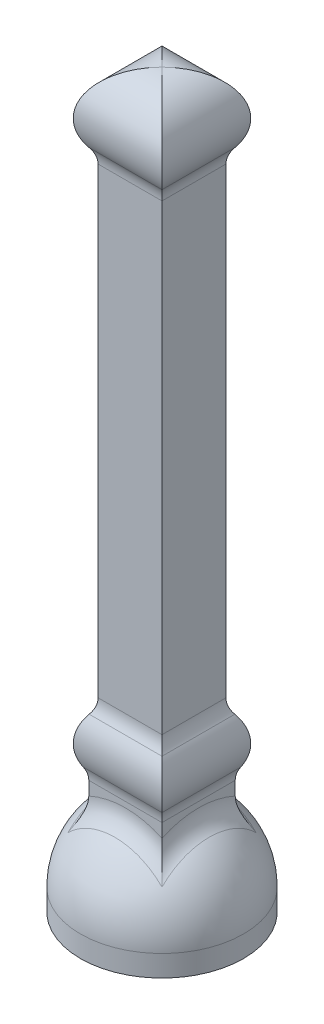
ISO-10303-21;
HEADER;
FILE_DESCRIPTION(('STEP AP214'),'2;1');
FILE_NAME('part.step','',(''),(''),'','','');
FILE_SCHEMA(('AUTOMOTIVE_DESIGN { 1 0 10303 214 1 1 1 1 }'));
ENDSEC;
DATA;
#1=APPLICATION_CONTEXT('core data for automotive mechanical design processes');
#2=APPLICATION_PROTOCOL_DEFINITION('international standard','automotive_design',2000,#1);
#3=PRODUCT_CONTEXT('',#1,'mechanical');
#4=PRODUCT('Part','Part','',(#3));
#5=PRODUCT_RELATED_PRODUCT_CATEGORY('part','',(#4));
#6=PRODUCT_DEFINITION_FORMATION('','',#4);
#7=PRODUCT_DEFINITION_CONTEXT('part definition',#1,'design');
#8=PRODUCT_DEFINITION('design','',#6,#7);
#9=PRODUCT_DEFINITION_SHAPE('','',#8);
#10=(LENGTH_UNIT() NAMED_UNIT(*) SI_UNIT(.MILLI.,.METRE.));
#11=(NAMED_UNIT(*) PLANE_ANGLE_UNIT() SI_UNIT($,.RADIAN.));
#12=(NAMED_UNIT(*) SI_UNIT($,.STERADIAN.) SOLID_ANGLE_UNIT());
#13=UNCERTAINTY_MEASURE_WITH_UNIT(LENGTH_MEASURE(1.E-05),#10,'distance_accuracy_value','');
#14=(GEOMETRIC_REPRESENTATION_CONTEXT(3) GLOBAL_UNCERTAINTY_ASSIGNED_CONTEXT((#13)) GLOBAL_UNIT_ASSIGNED_CONTEXT((#10,
#11,#12)) REPRESENTATION_CONTEXT('',''));
#15=CARTESIAN_POINT('',(0.,0.,0.));
#16=DIRECTION('',(0.,0.,1.));
#17=DIRECTION('',(1.,0.,0.));
#18=AXIS2_PLACEMENT_3D('',#15,#16,#17);
#19=CARTESIAN_POINT('',(-1.25,17.8825324213551,0.9));
#20=DIRECTION('',(0.,0.,-1.));
#21=DIRECTION('',(0.,1.,0.));
#22=AXIS2_PLACEMENT_3D('',#19,#20,#21);
#23=PLANE('',#22);
#24=DIRECTION('',(0.,-1.,0.));
#25=VECTOR('',#24,1.);
#26=CARTESIAN_POINT('',(-0.900000000000003,17.8825324213551,0.9));
#27=LINE('',#26,#25);
#28=CARTESIAN_POINT('',(-0.900000000000003,17.6353251595196,0.9));
#29=VERTEX_POINT('',#28);
#30=CARTESIAN_POINT('',(-0.900000000000002,4.6146748404804,0.899999999999998));
#31=VERTEX_POINT('',#30);
#32=EDGE_CURVE('E192',#29,#31,#27,.T.);
#33=ORIENTED_EDGE('',*,*,#32,.T.);
#34=DIRECTION('',(-1.,0.,0.));
#35=VECTOR('',#34,1.);
#36=CARTESIAN_POINT('',(0.899999999999988,4.6146748404804,0.899999999999999));
#37=LINE('',#36,#35);
#38=CARTESIAN_POINT('',(0.899999999999989,4.6146748404804,0.899999999999998));
#39=VERTEX_POINT('',#38);
#40=EDGE_CURVE('E292',#31,#39,#37,.F.);
#41=ORIENTED_EDGE('',*,*,#40,.T.);
#42=DIRECTION('',(0.,1.,0.));
#43=VECTOR('',#42,1.);
#44=CARTESIAN_POINT('',(0.899999999999991,17.8825324213551,0.9));
#45=LINE('',#44,#43);
#46=CARTESIAN_POINT('',(0.899999999999991,17.6353251595196,0.9));
#47=VERTEX_POINT('',#46);
#48=EDGE_CURVE('E162',#39,#47,#45,.T.);
#49=ORIENTED_EDGE('',*,*,#48,.T.);
#50=DIRECTION('',(-1.,0.,0.));
#51=VECTOR('',#50,1.);
#52=CARTESIAN_POINT('',(-0.900000000000004,17.6353251595196,0.9));
#53=LINE('',#52,#51);
#54=EDGE_CURVE('E289',#47,#29,#53,.T.);
#55=ORIENTED_EDGE('',*,*,#54,.T.);
#56=EDGE_LOOP('',(#33,#41,#49,#55));
#57=FACE_BOUND('',#56,.T.);
#58=ADVANCED_FACE('F39',(#57),#23,.F.);
#59=CARTESIAN_POINT('',(-1.25,18.75,0.));
#60=DIRECTION('',(1.,0.,0.));
#61=DIRECTION('',(0.,0.,-1.));
#62=AXIS2_PLACEMENT_3D('',#59,#60,#61);
#63=CYLINDRICAL_SURFACE('',#62,1.25);
#64=CARTESIAN_POINT('',(0.,18.75,0.));
#65=DIRECTION('',(0.707106781186546,0.,0.707106781186549));
#66=DIRECTION('',(0.707106781186549,0.,-0.707106781186546));
#67=AXIS2_PLACEMENT_3D('',#64,#65,#66);
#68=ELLIPSE('',#67,1.76776695296637,1.25);
#69=CARTESIAN_POINT('',(0.,20.,0.));
#70=VERTEX_POINT('',#69);
#71=CARTESIAN_POINT('',(-1.02564102564103,18.0354648458459,1.02564102564103));
#72=VERTEX_POINT('',#71);
#73=EDGE_CURVE('E158',#70,#72,#68,.T.);
#74=ORIENTED_EDGE('',*,*,#73,.T.);
#75=DIRECTION('',(1.,0.,0.));
#76=VECTOR('',#75,1.);
#77=CARTESIAN_POINT('',(-1.25,18.0354648458459,1.02564102564103));
#78=LINE('',#77,#76);
#79=CARTESIAN_POINT('',(1.02564102564102,18.0354648458459,1.02564102564103));
#80=VERTEX_POINT('',#79);
#81=EDGE_CURVE('E49',#72,#80,#78,.T.);
#82=ORIENTED_EDGE('',*,*,#81,.T.);
#83=CARTESIAN_POINT('',(0.,18.75,0.));
#84=DIRECTION('',(0.707106781186551,0.,-0.707106781186544));
#85=DIRECTION('',(0.707106781186544,0.,0.707106781186551));
#86=AXIS2_PLACEMENT_3D('',#83,#84,#85);
#87=ELLIPSE('',#86,1.76776695296636,1.25);
#88=EDGE_CURVE('E155',#80,#70,#87,.F.);
#89=ORIENTED_EDGE('',*,*,#88,.T.);
#90=EDGE_LOOP('',(#74,#82,#89));
#91=FACE_BOUND('',#90,.T.);
#92=ADVANCED_FACE('F157',(#91),#63,.T.);
#93=CARTESIAN_POINT('',(-0.899999999999996,17.8825324213551,-1.25000000000001));
#94=DIRECTION('',(1.,0.,0.));
#95=DIRECTION('',(0.,0.,-1.));
#96=AXIS2_PLACEMENT_3D('',#93,#94,#95);
#97=PLANE('',#96);
#98=DIRECTION('',(0.,-1.,0.));
#99=VECTOR('',#98,1.);
#100=CARTESIAN_POINT('',(-0.899999999999997,17.8825324213551,-0.9));
#101=LINE('',#100,#99);
#102=CARTESIAN_POINT('',(-0.899999999999997,17.6353251595196,-0.9));
#103=VERTEX_POINT('',#102);
#104=CARTESIAN_POINT('',(-0.899999999999995,4.6146748404804,-0.899999999999998));
#105=VERTEX_POINT('',#104);
#106=EDGE_CURVE('E183',#103,#105,#101,.T.);
#107=ORIENTED_EDGE('',*,*,#106,.T.);
#108=DIRECTION('',(0.,0.,-1.));
#109=VECTOR('',#108,1.);
#110=CARTESIAN_POINT('',(-0.900000000000002,4.6146748404804,0.899999999999998));
#111=LINE('',#110,#109);
#112=EDGE_CURVE('E286',#105,#31,#111,.F.);
#113=ORIENTED_EDGE('',*,*,#112,.T.);
#114=ORIENTED_EDGE('',*,*,#32,.F.);
#115=DIRECTION('',(0.,0.,-1.));
#116=VECTOR('',#115,1.);
#117=CARTESIAN_POINT('',(-0.899999999999997,17.6353251595196,-0.9));
#118=LINE('',#117,#116);
#119=EDGE_CURVE('E283',#29,#103,#118,.T.);
#120=ORIENTED_EDGE('',*,*,#119,.T.);
#121=EDGE_LOOP('',(#107,#113,#114,#120));
#122=FACE_BOUND('',#121,.T.);
#123=ADVANCED_FACE('F404',(#122),#97,.F.);
#124=CARTESIAN_POINT('',(-1.25,3.5,0.));
#125=DIRECTION('',(1.,0.,0.));
#126=DIRECTION('',(0.,0.,-1.));
#127=AXIS2_PLACEMENT_3D('',#124,#125,#126);
#128=CYLINDRICAL_SURFACE('',#127,1.25);
#129=CARTESIAN_POINT('',(0.,3.5,0.));
#130=DIRECTION('',(0.707106781186546,0.,0.707106781186549));
#131=DIRECTION('',(0.707106781186549,0.,-0.707106781186546));
#132=AXIS2_PLACEMENT_3D('',#129,#130,#131);
#133=ELLIPSE('',#132,1.76776695296637,1.25);
#134=CARTESIAN_POINT('',(-1.02564102564103,4.2145351541541,1.02564102564102));
#135=VERTEX_POINT('',#134);
#136=CARTESIAN_POINT('',(-1.10965786412102,2.92453547060277,1.10965786412102));
#137=VERTEX_POINT('',#136);
#138=EDGE_CURVE('E182',#135,#137,#133,.T.);
#139=ORIENTED_EDGE('',*,*,#138,.T.);
#140=DIRECTION('',(1.,0.,0.));
#141=VECTOR('',#140,1.);
#142=CARTESIAN_POINT('',(-1.25,2.92453547060277,1.10965786412102));
#143=LINE('',#142,#141);
#144=CARTESIAN_POINT('',(1.10965786412101,2.92453547060277,1.10965786412102));
#145=VERTEX_POINT('',#144);
#146=EDGE_CURVE('E221',#137,#145,#143,.T.);
#147=ORIENTED_EDGE('',*,*,#146,.T.);
#148=CARTESIAN_POINT('',(0.,3.5,0.));
#149=DIRECTION('',(0.707106781186551,0.,-0.707106781186544));
#150=DIRECTION('',(0.707106781186544,0.,0.707106781186551));
#151=AXIS2_PLACEMENT_3D('',#148,#149,#150);
#152=ELLIPSE('',#151,1.76776695296636,1.25);
#153=CARTESIAN_POINT('',(1.02564102564101,4.2145351541541,1.02564102564102));
#154=VERTEX_POINT('',#153);
#155=EDGE_CURVE('E163',#145,#154,#152,.F.);
#156=ORIENTED_EDGE('',*,*,#155,.T.);
#157=DIRECTION('',(1.,0.,0.));
#158=VECTOR('',#157,1.);
#159=CARTESIAN_POINT('',(-1.25,4.2145351541541,1.02564102564102));
#160=LINE('',#159,#158);
#161=EDGE_CURVE('E218',#154,#135,#160,.F.);
#162=ORIENTED_EDGE('',*,*,#161,.T.);
#163=EDGE_LOOP('',(#139,#147,#156,#162));
#164=FACE_BOUND('',#163,.T.);
#165=ADVANCED_FACE('F441',(#164),#128,.T.);
#166=CARTESIAN_POINT('',(-1.25,2.79331594688065,1.03106626802879));
#167=DIRECTION('',(0.,0.,-1.));
#168=DIRECTION('',(-1.,0.,0.));
#169=AXIS2_PLACEMENT_3D('',#166,#167,#168);
#170=PLANE('',#169);
#171=DIRECTION('',(0.,1.,0.));
#172=VECTOR('',#171,1.);
#173=CARTESIAN_POINT('',(1.03106626802878,2.79331594688065,1.03106626802879));
#174=LINE('',#173,#172);
#175=CARTESIAN_POINT('',(1.03106626802878,2.2176981728417,1.03106626802879));
#176=VERTEX_POINT('',#175);
#177=CARTESIAN_POINT('',(1.03106626802878,2.60227533414031,1.03106626802879));
#178=VERTEX_POINT('',#177);
#179=EDGE_CURVE('E494',#176,#178,#174,.T.);
#180=ORIENTED_EDGE('',*,*,#179,.T.);
#181=DIRECTION('',(-1.,0.,0.));
#182=VECTOR('',#181,1.);
#183=CARTESIAN_POINT('',(-1.03106626802879,2.60227533414031,1.03106626802879));
#184=LINE('',#183,#182);
#185=CARTESIAN_POINT('',(-1.03106626802879,2.60227533414031,1.03106626802879));
#186=VERTEX_POINT('',#185);
#187=EDGE_CURVE('E227',#178,#186,#184,.T.);
#188=ORIENTED_EDGE('',*,*,#187,.T.);
#189=DIRECTION('',(0.,-1.,0.));
#190=VECTOR('',#189,1.);
#191=CARTESIAN_POINT('',(-1.03106626802879,2.79331594688065,1.03106626802879));
#192=LINE('',#191,#190);
#193=CARTESIAN_POINT('',(-1.03106626802879,2.21769817284169,1.03106626802879));
#194=VERTEX_POINT('',#193);
#195=EDGE_CURVE('E187',#186,#194,#192,.T.);
#196=ORIENTED_EDGE('',*,*,#195,.T.);
#197=CARTESIAN_POINT('',(0.,0.,1.03106626802879));
#198=DIRECTION('',(0.,0.,-1.));
#199=DIRECTION('',(-1.,0.,0.));
#200=AXIS2_PLACEMENT_3D('',#197,#198,#199);
#201=CIRCLE('',#200,2.44566613316131);
#202=EDGE_CURVE('E224',#194,#176,#201,.T.);
#203=ORIENTED_EDGE('',*,*,#202,.T.);
#204=EDGE_LOOP('',(#180,#188,#196,#203));
#205=FACE_BOUND('',#204,.T.);
#206=ADVANCED_FACE('F486',(#205),#170,.F.);
#207=CARTESIAN_POINT('',(0.,18.75,-1.25));
#208=DIRECTION('',(0.,0.,1.));
#209=DIRECTION('',(1.,0.,0.));
#210=AXIS2_PLACEMENT_3D('',#207,#208,#209);
#211=CYLINDRICAL_SURFACE('',#210,1.25);
#212=CARTESIAN_POINT('',(0.,18.75,0.));
#213=DIRECTION('',(-0.707106781186549,0.,0.707106781186546));
#214=DIRECTION('',(0.707106781186546,0.,0.707106781186549));
#215=AXIS2_PLACEMENT_3D('',#212,#213,#214);
#216=ELLIPSE('',#215,1.76776695296637,1.25);
#217=CARTESIAN_POINT('',(-1.02564102564102,18.0354648458459,-1.02564102564103));
#218=VERTEX_POINT('',#217);
#219=EDGE_CURVE('E177',#70,#218,#216,.T.);
#220=ORIENTED_EDGE('',*,*,#219,.T.);
#221=DIRECTION('',(0.,0.,1.));
#222=VECTOR('',#221,1.);
#223=CARTESIAN_POINT('',(-1.02564102564102,18.0354648458459,-1.25000000000001));
#224=LINE('',#223,#222);
#225=EDGE_CURVE('E64',#218,#72,#224,.T.);
#226=ORIENTED_EDGE('',*,*,#225,.T.);
#227=ORIENTED_EDGE('',*,*,#73,.F.);
#228=EDGE_LOOP('',(#220,#226,#227));
#229=FACE_BOUND('',#228,.T.);
#230=ADVANCED_FACE('F185',(#229),#211,.T.);
#231=CARTESIAN_POINT('',(0.,3.5,-1.25));
#232=DIRECTION('',(0.,0.,1.));
#233=DIRECTION('',(1.,0.,0.));
#234=AXIS2_PLACEMENT_3D('',#231,#232,#233);
#235=CYLINDRICAL_SURFACE('',#234,1.25);
#236=CARTESIAN_POINT('',(0.,3.5,0.));
#237=DIRECTION('',(-0.707106781186549,0.,0.707106781186546));
#238=DIRECTION('',(0.707106781186546,0.,0.707106781186549));
#239=AXIS2_PLACEMENT_3D('',#236,#237,#238);
#240=ELLIPSE('',#239,1.76776695296637,1.25);
#241=CARTESIAN_POINT('',(-1.02564102564102,4.2145351541541,-1.02564102564102));
#242=VERTEX_POINT('',#241);
#243=CARTESIAN_POINT('',(-1.10965786412101,2.92453547060277,-1.10965786412102));
#244=VERTEX_POINT('',#243);
#245=EDGE_CURVE('E423',#242,#244,#240,.T.);
#246=ORIENTED_EDGE('',*,*,#245,.T.);
#247=DIRECTION('',(0.,0.,1.));
#248=VECTOR('',#247,1.);
#249=CARTESIAN_POINT('',(-1.10965786412101,2.92453547060277,-1.25000000000001));
#250=LINE('',#249,#248);
#251=EDGE_CURVE('E207',#244,#137,#250,.T.);
#252=ORIENTED_EDGE('',*,*,#251,.T.);
#253=ORIENTED_EDGE('',*,*,#138,.F.);
#254=DIRECTION('',(0.,0.,1.));
#255=VECTOR('',#254,1.);
#256=CARTESIAN_POINT('',(-1.02564102564102,4.2145351541541,-1.25000000000001));
#257=LINE('',#256,#255);
#258=EDGE_CURVE('E204',#135,#242,#257,.F.);
#259=ORIENTED_EDGE('',*,*,#258,.T.);
#260=EDGE_LOOP('',(#246,#252,#253,#259));
#261=FACE_BOUND('',#260,.T.);
#262=ADVANCED_FACE('F443',(#261),#235,.T.);
#263=CARTESIAN_POINT('',(-1.03106626802878,2.79331594688065,-1.25000000000001));
#264=DIRECTION('',(1.,0.,0.));
#265=DIRECTION('',(0.,0.,-1.));
#266=AXIS2_PLACEMENT_3D('',#263,#264,#265);
#267=PLANE('',#266);
#268=ORIENTED_EDGE('',*,*,#195,.F.);
#269=DIRECTION('',(0.,0.,-1.));
#270=VECTOR('',#269,1.);
#271=CARTESIAN_POINT('',(-1.03106626802878,2.60227533414031,-1.03106626802879));
#272=LINE('',#271,#270);
#273=CARTESIAN_POINT('',(-1.03106626802878,2.60227533414031,-1.03106626802879));
#274=VERTEX_POINT('',#273);
#275=EDGE_CURVE('E214',#186,#274,#272,.T.);
#276=ORIENTED_EDGE('',*,*,#275,.T.);
#277=DIRECTION('',(0.,-1.,0.));
#278=VECTOR('',#277,1.);
#279=CARTESIAN_POINT('',(-1.03106626802878,2.79331594688065,-1.03106626802879));
#280=LINE('',#279,#278);
#281=CARTESIAN_POINT('',(-1.03106626802878,2.21769817284169,-1.03106626802879));
#282=VERTEX_POINT('',#281);
#283=EDGE_CURVE('E200',#274,#282,#280,.T.);
#284=ORIENTED_EDGE('',*,*,#283,.T.);
#285=CARTESIAN_POINT('',(-1.03106626802879,0.,0.));
#286=DIRECTION('',(1.,0.,0.));
#287=DIRECTION('',(0.,0.,-1.));
#288=AXIS2_PLACEMENT_3D('',#285,#286,#287);
#289=CIRCLE('',#288,2.44566613316131);
#290=EDGE_CURVE('E211',#282,#194,#289,.T.);
#291=ORIENTED_EDGE('',*,*,#290,.T.);
#292=EDGE_LOOP('',(#268,#276,#284,#291));
#293=FACE_BOUND('',#292,.T.);
#294=ADVANCED_FACE('F471',(#293),#267,.F.);
#295=CARTESIAN_POINT('',(1.25,18.75,0.));
#296=DIRECTION('',(-1.,0.,0.));
#297=DIRECTION('',(0.,0.,1.));
#298=AXIS2_PLACEMENT_3D('',#295,#296,#297);
#299=CYLINDRICAL_SURFACE('',#298,1.25);
#300=CARTESIAN_POINT('',(0.,18.75,0.));
#301=DIRECTION('',(-0.707106781186544,0.,-0.707106781186551));
#302=DIRECTION('',(-0.707106781186551,0.,0.707106781186544));
#303=AXIS2_PLACEMENT_3D('',#300,#301,#302);
#304=ELLIPSE('',#303,1.76776695296638,1.25);
#305=CARTESIAN_POINT('',(1.02564102564104,18.0354648458459,-1.02564102564103));
#306=VERTEX_POINT('',#305);
#307=EDGE_CURVE('E166',#70,#306,#304,.T.);
#308=ORIENTED_EDGE('',*,*,#307,.T.);
#309=DIRECTION('',(-1.,0.,0.));
#310=VECTOR('',#309,1.);
#311=CARTESIAN_POINT('',(1.25,18.0354648458459,-1.02564102564103));
#312=LINE('',#311,#310);
#313=EDGE_CURVE('E180',#306,#218,#312,.T.);
#314=ORIENTED_EDGE('',*,*,#313,.T.);
#315=ORIENTED_EDGE('',*,*,#219,.F.);
#316=EDGE_LOOP('',(#308,#314,#315));
#317=FACE_BOUND('',#316,.T.);
#318=ADVANCED_FACE('F178',(#317),#299,.T.);
#319=CARTESIAN_POINT('',(1.25,17.8825324213551,-0.9));
#320=DIRECTION('',(0.,0.,1.));
#321=DIRECTION('',(0.,-1.,0.));
#322=AXIS2_PLACEMENT_3D('',#319,#320,#321);
#323=PLANE('',#322);
#324=DIRECTION('',(0.,-1.,0.));
#325=VECTOR('',#324,1.);
#326=CARTESIAN_POINT('',(0.90000000000001,17.8825324213551,-0.9));
#327=LINE('',#326,#325);
#328=CARTESIAN_POINT('',(0.90000000000001,17.6353251595196,-0.9));
#329=VERTEX_POINT('',#328);
#330=CARTESIAN_POINT('',(0.900000000000008,4.6146748404804,-0.899999999999998));
#331=VERTEX_POINT('',#330);
#332=EDGE_CURVE('E457',#329,#331,#327,.T.);
#333=ORIENTED_EDGE('',*,*,#332,.T.);
#334=DIRECTION('',(1.,0.,0.));
#335=VECTOR('',#334,1.);
#336=CARTESIAN_POINT('',(-0.899999999999995,4.6146748404804,-0.899999999999998));
#337=LINE('',#336,#335);
#338=EDGE_CURVE('E280',#331,#105,#337,.F.);
#339=ORIENTED_EDGE('',*,*,#338,.T.);
#340=ORIENTED_EDGE('',*,*,#106,.F.);
#341=DIRECTION('',(1.,0.,0.));
#342=VECTOR('',#341,1.);
#343=CARTESIAN_POINT('',(0.90000000000001,17.6353251595196,-0.9));
#344=LINE('',#343,#342);
#345=EDGE_CURVE('E276',#103,#329,#344,.T.);
#346=ORIENTED_EDGE('',*,*,#345,.T.);
#347=EDGE_LOOP('',(#333,#339,#340,#346));
#348=FACE_BOUND('',#347,.T.);
#349=ADVANCED_FACE('F724',(#348),#323,.F.);
#350=CARTESIAN_POINT('',(1.25,3.5,0.));
#351=DIRECTION('',(-1.,0.,0.));
#352=DIRECTION('',(0.,0.,1.));
#353=AXIS2_PLACEMENT_3D('',#350,#351,#352);
#354=CYLINDRICAL_SURFACE('',#353,1.25);
#355=CARTESIAN_POINT('',(0.,3.5,0.));
#356=DIRECTION('',(-0.707106781186544,0.,-0.707106781186551));
#357=DIRECTION('',(-0.707106781186551,0.,0.707106781186544));
#358=AXIS2_PLACEMENT_3D('',#355,#356,#357);
#359=ELLIPSE('',#358,1.76776695296638,1.25);
#360=CARTESIAN_POINT('',(1.02564102564104,4.2145351541541,-1.02564102564102));
#361=VERTEX_POINT('',#360);
#362=CARTESIAN_POINT('',(1.10965786412103,2.92453547060277,-1.10965786412102));
#363=VERTEX_POINT('',#362);
#364=EDGE_CURVE('E175',#361,#363,#359,.T.);
#365=ORIENTED_EDGE('',*,*,#364,.T.);
#366=DIRECTION('',(-1.,0.,0.));
#367=VECTOR('',#366,1.);
#368=CARTESIAN_POINT('',(1.25,2.92453547060277,-1.10965786412102));
#369=LINE('',#368,#367);
#370=EDGE_CURVE('E246',#363,#244,#369,.T.);
#371=ORIENTED_EDGE('',*,*,#370,.T.);
#372=ORIENTED_EDGE('',*,*,#245,.F.);
#373=DIRECTION('',(-1.,0.,0.));
#374=VECTOR('',#373,1.);
#375=CARTESIAN_POINT('',(1.25,4.2145351541541,-1.02564102564102));
#376=LINE('',#375,#374);
#377=EDGE_CURVE('E243',#242,#361,#376,.F.);
#378=ORIENTED_EDGE('',*,*,#377,.T.);
#379=EDGE_LOOP('',(#365,#371,#372,#378));
#380=FACE_BOUND('',#379,.T.);
#381=ADVANCED_FACE('F420',(#380),#354,.T.);
#382=CARTESIAN_POINT('',(1.25,2.79331594688065,-1.03106626802879));
#383=DIRECTION('',(0.,0.,1.));
#384=DIRECTION('',(1.,0.,0.));
#385=AXIS2_PLACEMENT_3D('',#382,#383,#384);
#386=PLANE('',#385);
#387=ORIENTED_EDGE('',*,*,#283,.F.);
#388=DIRECTION('',(1.,0.,0.));
#389=VECTOR('',#388,1.);
#390=CARTESIAN_POINT('',(1.0310662680288,2.60227533414031,-1.03106626802879));
#391=LINE('',#390,#389);
#392=CARTESIAN_POINT('',(1.0310662680288,2.60227533414031,-1.03106626802879));
#393=VERTEX_POINT('',#392);
#394=EDGE_CURVE('E253',#274,#393,#391,.T.);
#395=ORIENTED_EDGE('',*,*,#394,.T.);
#396=DIRECTION('',(0.,-1.,0.));
#397=VECTOR('',#396,1.);
#398=CARTESIAN_POINT('',(1.0310662680288,2.79331594688065,-1.03106626802879));
#399=LINE('',#398,#397);
#400=CARTESIAN_POINT('',(1.0310662680288,2.21769817284169,-1.03106626802879));
#401=VERTEX_POINT('',#400);
#402=EDGE_CURVE('E174',#393,#401,#399,.T.);
#403=ORIENTED_EDGE('',*,*,#402,.T.);
#404=CARTESIAN_POINT('',(0.,0.,-1.03106626802879));
#405=DIRECTION('',(0.,0.,1.));
#406=DIRECTION('',(1.,0.,0.));
#407=AXIS2_PLACEMENT_3D('',#404,#405,#406);
#408=CIRCLE('',#407,2.44566613316131);
#409=EDGE_CURVE('E249',#401,#282,#408,.T.);
#410=ORIENTED_EDGE('',*,*,#409,.T.);
#411=EDGE_LOOP('',(#387,#395,#403,#410));
#412=FACE_BOUND('',#411,.T.);
#413=ADVANCED_FACE('F472',(#412),#386,.F.);
#414=CARTESIAN_POINT('',(1.03106626802878,2.79331594688065,1.25000000000002));
#415=DIRECTION('',(-1.,0.,0.));
#416=DIRECTION('',(0.,0.,1.));
#417=AXIS2_PLACEMENT_3D('',#414,#415,#416);
#418=PLANE('',#417);
#419=ORIENTED_EDGE('',*,*,#402,.F.);
#420=DIRECTION('',(0.,0.,1.));
#421=VECTOR('',#420,1.);
#422=CARTESIAN_POINT('',(1.03106626802878,2.60227533414031,1.03106626802879));
#423=LINE('',#422,#421);
#424=EDGE_CURVE('E240',#393,#178,#423,.T.);
#425=ORIENTED_EDGE('',*,*,#424,.T.);
#426=ORIENTED_EDGE('',*,*,#179,.F.);
#427=CARTESIAN_POINT('',(1.03106626802879,0.,0.));
#428=DIRECTION('',(-1.,0.,0.));
#429=DIRECTION('',(0.,0.,1.));
#430=AXIS2_PLACEMENT_3D('',#427,#428,#429);
#431=CIRCLE('',#430,2.44566613316131);
#432=EDGE_CURVE('E237',#176,#401,#431,.T.);
#433=ORIENTED_EDGE('',*,*,#432,.T.);
#434=EDGE_LOOP('',(#419,#425,#426,#433));
#435=FACE_BOUND('',#434,.T.);
#436=ADVANCED_FACE('F493',(#435),#418,.F.);
#437=CARTESIAN_POINT('',(0.899999999999987,17.8825324213551,1.25000000000002));
#438=DIRECTION('',(-1.,0.,0.));
#439=DIRECTION('',(0.,0.,1.));
#440=AXIS2_PLACEMENT_3D('',#437,#438,#439);
#441=PLANE('',#440);
#442=ORIENTED_EDGE('',*,*,#48,.F.);
#443=DIRECTION('',(0.,0.,1.));
#444=VECTOR('',#443,1.);
#445=CARTESIAN_POINT('',(0.900000000000008,4.6146748404804,-0.899999999999999));
#446=LINE('',#445,#444);
#447=EDGE_CURVE('E272',#39,#331,#446,.F.);
#448=ORIENTED_EDGE('',*,*,#447,.T.);
#449=ORIENTED_EDGE('',*,*,#332,.F.);
#450=DIRECTION('',(0.,0.,1.));
#451=VECTOR('',#450,1.);
#452=CARTESIAN_POINT('',(0.899999999999991,17.6353251595196,0.9));
#453=LINE('',#452,#451);
#454=EDGE_CURVE('E269',#329,#47,#453,.T.);
#455=ORIENTED_EDGE('',*,*,#454,.T.);
#456=EDGE_LOOP('',(#442,#448,#449,#455));
#457=FACE_BOUND('',#456,.T.);
#458=ADVANCED_FACE('F695',(#457),#441,.F.);
#459=CARTESIAN_POINT('',(0.,18.75,1.25000000000001));
#460=DIRECTION('',(0.,0.,-1.));
#461=DIRECTION('',(-1.,0.,0.));
#462=AXIS2_PLACEMENT_3D('',#459,#460,#461);
#463=CYLINDRICAL_SURFACE('',#462,1.25);
#464=ORIENTED_EDGE('',*,*,#88,.F.);
#465=DIRECTION('',(0.,0.,-1.));
#466=VECTOR('',#465,1.);
#467=CARTESIAN_POINT('',(1.02564102564101,18.0354648458459,1.25000000000002));
#468=LINE('',#467,#466);
#469=EDGE_CURVE('E11',#80,#306,#468,.T.);
#470=ORIENTED_EDGE('',*,*,#469,.T.);
#471=ORIENTED_EDGE('',*,*,#307,.F.);
#472=EDGE_LOOP('',(#464,#470,#471));
#473=FACE_BOUND('',#472,.T.);
#474=ADVANCED_FACE('F168',(#473),#463,.T.);
#475=CARTESIAN_POINT('',(0.,3.5,1.25000000000001));
#476=DIRECTION('',(0.,0.,-1.));
#477=DIRECTION('',(-1.,0.,0.));
#478=AXIS2_PLACEMENT_3D('',#475,#476,#477);
#479=CYLINDRICAL_SURFACE('',#478,1.25);
#480=ORIENTED_EDGE('',*,*,#155,.F.);
#481=DIRECTION('',(0.,0.,-1.));
#482=VECTOR('',#481,1.);
#483=CARTESIAN_POINT('',(1.10965786412101,2.92453547060277,1.25000000000003));
#484=LINE('',#483,#482);
#485=EDGE_CURVE('E234',#145,#363,#484,.T.);
#486=ORIENTED_EDGE('',*,*,#485,.T.);
#487=ORIENTED_EDGE('',*,*,#364,.F.);
#488=DIRECTION('',(0.,0.,-1.));
#489=VECTOR('',#488,1.);
#490=CARTESIAN_POINT('',(1.02564102564101,4.2145351541541,1.25000000000002));
#491=LINE('',#490,#489);
#492=EDGE_CURVE('E230',#361,#154,#491,.F.);
#493=ORIENTED_EDGE('',*,*,#492,.T.);
#494=EDGE_LOOP('',(#480,#486,#487,#493));
#495=FACE_BOUND('',#494,.T.);
#496=ADVANCED_FACE('F427',(#495),#479,.T.);
#497=CARTESIAN_POINT('',(0.,0.,0.));
#498=DIRECTION('',(0.,-1.,0.));
#499=DIRECTION('',(0.,0.,-1.));
#500=AXIS2_PLACEMENT_3D('',#497,#498,#499);
#501=SPHERICAL_SURFACE('',#500,2.2963099404433);
#502=CARTESIAN_POINT('',(-1.32665336959516,0.,0.));
#503=DIRECTION('',(1.,0.,0.));
#504=DIRECTION('',(0.,0.,-1.));
#505=AXIS2_PLACEMENT_3D('',#502,#503,#504);
#506=CIRCLE('',#505,1.87430792014559);
#507=CARTESIAN_POINT('',(-1.32665336959516,1.32401700006544,1.32665336959516));
#508=VERTEX_POINT('',#507);
#509=CARTESIAN_POINT('',(-1.32665336959516,1.32401700006545,-1.32665336959516));
#510=VERTEX_POINT('',#509);
#511=EDGE_CURVE('E262',#508,#510,#506,.F.);
#512=ORIENTED_EDGE('',*,*,#511,.T.);
#513=CARTESIAN_POINT('',(0.,0.,-1.32665336959516));
#514=DIRECTION('',(0.,0.,1.));
#515=DIRECTION('',(1.,0.,0.));
#516=AXIS2_PLACEMENT_3D('',#513,#514,#515);
#517=CIRCLE('',#516,1.87430792014559);
#518=CARTESIAN_POINT('',(1.32665336959518,1.32401700006543,-1.32665336959516));
#519=VERTEX_POINT('',#518);
#520=EDGE_CURVE('E265',#510,#519,#517,.F.);
#521=ORIENTED_EDGE('',*,*,#520,.T.);
#522=CARTESIAN_POINT('',(1.32665336959516,0.,0.));
#523=DIRECTION('',(-1.,0.,0.));
#524=DIRECTION('',(0.,0.,1.));
#525=AXIS2_PLACEMENT_3D('',#522,#523,#524);
#526=CIRCLE('',#525,1.87430792014559);
#527=CARTESIAN_POINT('',(1.32665336959515,1.32401700006546,1.32665336959516));
#528=VERTEX_POINT('',#527);
#529=EDGE_CURVE('E256',#519,#528,#526,.F.);
#530=ORIENTED_EDGE('',*,*,#529,.T.);
#531=CARTESIAN_POINT('',(0.,0.,1.32665336959516));
#532=DIRECTION('',(0.,0.,-1.));
#533=DIRECTION('',(-1.,0.,0.));
#534=AXIS2_PLACEMENT_3D('',#531,#532,#533);
#535=CIRCLE('',#534,1.87430792014559);
#536=EDGE_CURVE('E259',#528,#508,#535,.F.);
#537=ORIENTED_EDGE('',*,*,#536,.T.);
#538=EDGE_LOOP('',(#512,#521,#530,#537));
#539=FACE_BOUND('',#538,.T.);
#540=CARTESIAN_POINT('',(0.,0.,0.));
#541=DIRECTION('',(0.,-1.,0.));
#542=DIRECTION('',(0.,0.,-1.));
#543=AXIS2_PLACEMENT_3D('',#540,#541,#542);
#544=CIRCLE('',#543,2.2963099404433);
#545=CARTESIAN_POINT('',(0.,0.,-2.2963099404433));
#546=VERTEX_POINT('',#545);
#547=EDGE_CURVE('E316',#546,#546,#544,.T.);
#548=ORIENTED_EDGE('',*,*,#547,.F.);
#549=EDGE_LOOP('',(#548));
#550=FACE_BOUND('',#549,.T.);
#551=ADVANCED_FACE('F525',(#539,#550),#501,.T.);
#552=CARTESIAN_POINT('',(1.73106626802878,2.60227533414031,1.25000000000003));
#553=DIRECTION('',(0.,0.,-1.));
#554=DIRECTION('',(-1.,0.,0.));
#555=AXIS2_PLACEMENT_3D('',#552,#553,#554);
#556=CYLINDRICAL_SURFACE('',#555,0.7);
#557=CARTESIAN_POINT('',(1.73106626802877,2.60227533414031,1.73106626802879));
#558=DIRECTION('',(0.707106781186551,0.,-0.707106781186544));
#559=DIRECTION('',(-0.707106781186544,0.,-0.707106781186551));
#560=AXIS2_PLACEMENT_3D('',#557,#558,#559);
#561=ELLIPSE('',#560,0.989949493661161,0.7);
#562=EDGE_CURVE('E308',#178,#145,#561,.T.);
#563=ORIENTED_EDGE('',*,*,#562,.F.);
#564=ORIENTED_EDGE('',*,*,#424,.F.);
#565=CARTESIAN_POINT('',(1.73106626802881,2.60227533414031,-1.73106626802879));
#566=DIRECTION('',(-0.707106781186544,0.,-0.707106781186551));
#567=DIRECTION('',(-0.707106781186551,0.,0.707106781186544));
#568=AXIS2_PLACEMENT_3D('',#565,#566,#567);
#569=ELLIPSE('',#568,0.989949493661172,0.7);
#570=EDGE_CURVE('E312',#363,#393,#569,.F.);
#571=ORIENTED_EDGE('',*,*,#570,.F.);
#572=ORIENTED_EDGE('',*,*,#485,.F.);
#573=EDGE_LOOP('',(#563,#564,#571,#572));
#574=FACE_BOUND('',#573,.T.);
#575=ADVANCED_FACE('F460',(#574),#556,.F.);
#576=CARTESIAN_POINT('',(1.25,2.60227533414031,-1.73106626802879));
#577=DIRECTION('',(-1.,0.,0.));
#578=DIRECTION('',(0.,0.,1.));
#579=AXIS2_PLACEMENT_3D('',#576,#577,#578);
#580=CYLINDRICAL_SURFACE('',#579,0.7);
#581=ORIENTED_EDGE('',*,*,#570,.T.);
#582=ORIENTED_EDGE('',*,*,#394,.F.);
#583=CARTESIAN_POINT('',(-1.73106626802878,2.60227533414031,-1.73106626802879));
#584=DIRECTION('',(-0.707106781186549,0.,0.707106781186546));
#585=DIRECTION('',(-0.707106781186546,0.,-0.707106781186549));
#586=AXIS2_PLACEMENT_3D('',#583,#584,#585);
#587=ELLIPSE('',#586,0.989949493661165,0.7);
#588=EDGE_CURVE('E304',#244,#274,#587,.F.);
#589=ORIENTED_EDGE('',*,*,#588,.F.);
#590=ORIENTED_EDGE('',*,*,#370,.F.);
#591=EDGE_LOOP('',(#581,#582,#589,#590));
#592=FACE_BOUND('',#591,.T.);
#593=ADVANCED_FACE('F464',(#592),#580,.F.);
#594=CARTESIAN_POINT('',(-1.25,2.60227533414031,1.73106626802879));
#595=DIRECTION('',(1.,0.,0.));
#596=DIRECTION('',(0.,0.,-1.));
#597=AXIS2_PLACEMENT_3D('',#594,#595,#596);
#598=CYLINDRICAL_SURFACE('',#597,0.7);
#599=ORIENTED_EDGE('',*,*,#562,.T.);
#600=ORIENTED_EDGE('',*,*,#146,.F.);
#601=CARTESIAN_POINT('',(-1.73106626802879,2.60227533414031,1.73106626802879));
#602=DIRECTION('',(0.707106781186546,0.,0.707106781186549));
#603=DIRECTION('',(0.707106781186549,0.,-0.707106781186546));
#604=AXIS2_PLACEMENT_3D('',#601,#602,#603);
#605=ELLIPSE('',#604,0.989949493661168,0.7);
#606=EDGE_CURVE('E301',#186,#137,#605,.T.);
#607=ORIENTED_EDGE('',*,*,#606,.F.);
#608=ORIENTED_EDGE('',*,*,#187,.F.);
#609=EDGE_LOOP('',(#599,#600,#607,#608));
#610=FACE_BOUND('',#609,.T.);
#611=ADVANCED_FACE('F454',(#610),#598,.F.);
#612=CARTESIAN_POINT('',(-1.73106626802878,2.60227533414031,-1.25000000000001));
#613=DIRECTION('',(0.,0.,1.));
#614=DIRECTION('',(1.,0.,0.));
#615=AXIS2_PLACEMENT_3D('',#612,#613,#614);
#616=CYLINDRICAL_SURFACE('',#615,0.7);
#617=ORIENTED_EDGE('',*,*,#588,.T.);
#618=ORIENTED_EDGE('',*,*,#275,.F.);
#619=ORIENTED_EDGE('',*,*,#606,.T.);
#620=ORIENTED_EDGE('',*,*,#251,.F.);
#621=EDGE_LOOP('',(#617,#618,#619,#620));
#622=FACE_BOUND('',#621,.T.);
#623=ADVANCED_FACE('F447',(#622),#616,.F.);
#624=CARTESIAN_POINT('',(0.,0.,1.73106626802879));
#625=DIRECTION('',(0.,0.,-1.));
#626=DIRECTION('',(-1.,0.,0.));
#627=AXIS2_PLACEMENT_3D('',#624,#625,#626);
#628=TOROIDAL_SURFACE('',#627,2.44566613316131,0.7);
#629=CARTESIAN_POINT('',(-1.03106626802879,2.21769817284169,1.03106626802879));
#630=CARTESIAN_POINT('',(-1.03106715049458,2.19281724974058,1.03106715049457));
#631=CARTESIAN_POINT('',(-1.03215587569916,2.1679923379004,1.03215587569916));
#632=CARTESIAN_POINT('',(-1.03618570682573,2.11873063608857,1.03618570682573));
#633=CARTESIAN_POINT('',(-1.03911994107111,2.09429274959352,1.03911994107111));
#634=CARTESIAN_POINT('',(-1.05008105431965,2.02262509704792,1.05008105431965));
#635=CARTESIAN_POINT('',(-1.06029182712635,1.97607494387627,1.06029182712635));
#636=CARTESIAN_POINT('',(-1.08703256245929,1.87624094688868,1.08703256245928));
#637=CARTESIAN_POINT('',(-1.10441159183168,1.82343944167159,1.10441159183168));
#638=CARTESIAN_POINT('',(-1.14255880403651,1.72031277046769,1.1425588040365));
#639=CARTESIAN_POINT('',(-1.16333334353732,1.66999248404213,1.16333334353732));
#640=CARTESIAN_POINT('',(-1.20702159101105,1.57058642640425,1.20702159101105));
#641=CARTESIAN_POINT('',(-1.22995457890906,1.52151798780316,1.22995457890906));
#642=CARTESIAN_POINT('',(-1.27676852826337,1.42429669347907,1.27676852826336));
#643=CARTESIAN_POINT('',(-1.30064966735064,1.37614401184117,1.30064966735064));
#644=CARTESIAN_POINT('',(-1.32530001263029,1.32672932885646,1.32530001263029));
#645=CARTESIAN_POINT('',(-1.3259766584868,1.32537313105868,1.32597665848679));
#646=CARTESIAN_POINT('',(-1.32665336959517,1.32401700006543,1.32665336959516));
#647=B_SPLINE_CURVE_WITH_KNOTS('',3,(#629,#630,#631,#632,#633,#634,#635,#636,#637,#638,#639,
#640,#641,#642,#643,#644,#645,#646),.UNSPECIFIED.,.F.,.F.,(4,2,2,2,2,2,2,2,4),(0.,
0.0745121305221412,0.148748447478773,0.294367929799864,0.468703417280028,0.643369093781565,
0.81977795157912,0.996220016025948,1.00119944806173),.UNSPECIFIED.);
#648=EDGE_CURVE('E360',#508,#194,#647,.F.);
#649=ORIENTED_EDGE('',*,*,#648,.F.);
#650=ORIENTED_EDGE('',*,*,#536,.F.);
#651=CARTESIAN_POINT('',(1.03106626802878,2.2176981728417,1.03106626802879));
#652=CARTESIAN_POINT('',(1.03106715049456,2.19281724974059,1.03106715049457));
#653=CARTESIAN_POINT('',(1.03215587569915,2.16799233790041,1.03215587569916));
#654=CARTESIAN_POINT('',(1.03618570682572,2.11873063608858,1.03618570682573));
#655=CARTESIAN_POINT('',(1.0391199410711,2.09429274959353,1.03911994107111));
#656=CARTESIAN_POINT('',(1.05008105431964,2.02262509704793,1.05008105431965));
#657=CARTESIAN_POINT('',(1.06029182712634,1.97607494387628,1.06029182712635));
#658=CARTESIAN_POINT('',(1.08703256245927,1.87624094688869,1.08703256245928));
#659=CARTESIAN_POINT('',(1.10441159183166,1.8234394416716,1.10441159183168));
#660=CARTESIAN_POINT('',(1.14255880403649,1.7203127704677,1.1425588040365));
#661=CARTESIAN_POINT('',(1.1633333435373,1.66999248404214,1.16333334353731));
#662=CARTESIAN_POINT('',(1.20702159101103,1.57058642640427,1.20702159101105));
#663=CARTESIAN_POINT('',(1.22995457890904,1.52151798780317,1.22995457890906));
#664=CARTESIAN_POINT('',(1.27676852826335,1.42429669347909,1.27676852826336));
#665=CARTESIAN_POINT('',(1.30064966735064,1.37614401184119,1.30064966735063));
#666=CARTESIAN_POINT('',(1.32530001263027,1.32672932885648,1.32530001263029));
#667=CARTESIAN_POINT('',(1.32597665848678,1.3253731310587,1.32597665848679));
#668=CARTESIAN_POINT('',(1.32665336959515,1.32401700006545,1.32665336959516));
#669=B_SPLINE_CURVE_WITH_KNOTS('',3,(#651,#652,#653,#654,#655,#656,#657,#658,#659,#660,#661,
#662,#663,#664,#665,#666,#667,#668),.UNSPECIFIED.,.F.,.F.,(4,2,2,2,2,2,2,2,4),(0.,
0.0745121305221403,0.148748447478772,0.294367929799861,0.468703417280023,0.643369093781558,
0.819777951579111,0.996220016025937,1.00119944806172),.UNSPECIFIED.);
#670=EDGE_CURVE('E305',#176,#528,#669,.T.);
#671=ORIENTED_EDGE('',*,*,#670,.F.);
#672=ORIENTED_EDGE('',*,*,#202,.F.);
#673=EDGE_LOOP('',(#649,#650,#671,#672));
#674=FACE_BOUND('',#673,.T.);
#675=ADVANCED_FACE('F347',(#674),#628,.F.);
#676=CARTESIAN_POINT('',(1.73106626802879,0.,0.));
#677=DIRECTION('',(-1.,0.,0.));
#678=DIRECTION('',(0.,0.,1.));
#679=AXIS2_PLACEMENT_3D('',#676,#677,#678);
#680=TOROIDAL_SURFACE('',#679,2.44566613316131,0.7);
#681=ORIENTED_EDGE('',*,*,#670,.T.);
#682=ORIENTED_EDGE('',*,*,#529,.F.);
#683=CARTESIAN_POINT('',(1.0310662680288,2.21769817284169,-1.03106626802879));
#684=CARTESIAN_POINT('',(1.03106715049458,2.19281724974058,-1.03106715049457));
#685=CARTESIAN_POINT('',(1.03215587569917,2.1679923379004,-1.03215587569916));
#686=CARTESIAN_POINT('',(1.03618570682574,2.11873063608857,-1.03618570682573));
#687=CARTESIAN_POINT('',(1.03911994107112,2.09429274959352,-1.03911994107111));
#688=CARTESIAN_POINT('',(1.05008105431966,2.02262509704792,-1.05008105431965));
#689=CARTESIAN_POINT('',(1.06029182712636,1.97607494387626,-1.06029182712635));
#690=CARTESIAN_POINT('',(1.0870325624593,1.87624094688868,-1.08703256245928));
#691=CARTESIAN_POINT('',(1.10441159183169,1.82343944167158,-1.10441159183167));
#692=CARTESIAN_POINT('',(1.14255880403651,1.72031277046769,-1.14255880403651));
#693=CARTESIAN_POINT('',(1.1633333435373,1.66999248404213,-1.16333334353734));
#694=CARTESIAN_POINT('',(1.20702159101109,1.57058642640425,-1.20702159101102));
#695=CARTESIAN_POINT('',(1.22995457890917,1.52151798780315,-1.22995457890896));
#696=CARTESIAN_POINT('',(1.27676852826328,1.42429669347906,-1.27676852826346));
#697=CARTESIAN_POINT('',(1.30064966735028,1.37614401184116,-1.30064966735101));
#698=CARTESIAN_POINT('',(1.32530001263028,1.32672932885645,-1.32530001263031));
#699=CARTESIAN_POINT('',(1.3259766584868,1.32537313105867,-1.3259766584868));
#700=CARTESIAN_POINT('',(1.32665336959518,1.32401700006543,-1.32665336959516));
#701=B_SPLINE_CURVE_WITH_KNOTS('',3,(#683,#684,#685,#686,#687,#688,#689,#690,#691,#692,#693,
#694,#695,#696,#697,#698,#699,#700),.UNSPECIFIED.,.F.,.F.,(4,2,2,2,2,2,2,2,4),(0.,
0.0745121305221416,0.148748447478774,0.294367929799865,0.468703417280031,0.643369093781568,
0.819777951579125,0.996220016025954,1.00119944806174),.UNSPECIFIED.);
#702=EDGE_CURVE('E326',#401,#519,#701,.T.);
#703=ORIENTED_EDGE('',*,*,#702,.F.);
#704=ORIENTED_EDGE('',*,*,#432,.F.);
#705=EDGE_LOOP('',(#681,#682,#703,#704));
#706=FACE_BOUND('',#705,.T.);
#707=ADVANCED_FACE('F342',(#706),#680,.F.);
#708=CARTESIAN_POINT('',(-1.73106626802879,0.,0.));
#709=DIRECTION('',(1.,0.,0.));
#710=DIRECTION('',(0.,0.,-1.));
#711=AXIS2_PLACEMENT_3D('',#708,#709,#710);
#712=TOROIDAL_SURFACE('',#711,2.44566613316131,0.7);
#713=ORIENTED_EDGE('',*,*,#648,.T.);
#714=ORIENTED_EDGE('',*,*,#290,.F.);
#715=CARTESIAN_POINT('',(-1.03106626802878,2.21769817284169,-1.03106626802879));
#716=CARTESIAN_POINT('',(-1.03106715049457,2.19281724974059,-1.03106715049457));
#717=CARTESIAN_POINT('',(-1.03215587569916,2.1679923379004,-1.03215587569916));
#718=CARTESIAN_POINT('',(-1.03618570682572,2.11873063608858,-1.03618570682573));
#719=CARTESIAN_POINT('',(-1.03911994107111,2.09429274959353,-1.03911994107111));
#720=CARTESIAN_POINT('',(-1.05008105431964,2.02262509704792,-1.05008105431965));
#721=CARTESIAN_POINT('',(-1.06029182712635,1.97607494387627,-1.06029182712635));
#722=CARTESIAN_POINT('',(-1.08703256245928,1.87624094688869,-1.08703256245928));
#723=CARTESIAN_POINT('',(-1.10441159183167,1.82343944167159,-1.10441159183168));
#724=CARTESIAN_POINT('',(-1.1425588040365,1.7203127704677,-1.1425588040365));
#725=CARTESIAN_POINT('',(-1.16333334353731,1.66999248404214,-1.16333334353732));
#726=CARTESIAN_POINT('',(-1.20702159101104,1.57058642640426,-1.20702159101104));
#727=CARTESIAN_POINT('',(-1.22995457890906,1.52151798780317,-1.22995457890905));
#728=CARTESIAN_POINT('',(-1.27676852826335,1.42429669347908,-1.27676852826337));
#729=CARTESIAN_POINT('',(-1.30064966735062,1.37614401184118,-1.30064966735066));
#730=CARTESIAN_POINT('',(-1.32530001263028,1.32672932885647,-1.32530001263029));
#731=CARTESIAN_POINT('',(-1.32597665848679,1.32537313105869,-1.32597665848679));
#732=CARTESIAN_POINT('',(-1.32665336959516,1.32401700006544,-1.32665336959516));
#733=B_SPLINE_CURVE_WITH_KNOTS('',3,(#715,#716,#717,#718,#719,#720,#721,#722,#723,#724,#725,
#726,#727,#728,#729,#730,#731,#732),.UNSPECIFIED.,.F.,.F.,(4,2,2,2,2,2,2,2,4),(0.,
0.0745121305221408,0.148748447478773,0.294367929799864,0.468703417280026,0.643369093781561,
0.819777951579115,0.996220016025942,1.00119944806173),.UNSPECIFIED.);
#734=EDGE_CURVE('E317',#510,#282,#733,.F.);
#735=ORIENTED_EDGE('',*,*,#734,.F.);
#736=ORIENTED_EDGE('',*,*,#511,.F.);
#737=EDGE_LOOP('',(#713,#714,#735,#736));
#738=FACE_BOUND('',#737,.T.);
#739=ADVANCED_FACE('F334',(#738),#712,.F.);
#740=CARTESIAN_POINT('',(0.,0.,-1.73106626802879));
#741=DIRECTION('',(0.,0.,1.));
#742=DIRECTION('',(1.,0.,0.));
#743=AXIS2_PLACEMENT_3D('',#740,#741,#742);
#744=TOROIDAL_SURFACE('',#743,2.44566613316131,0.7);
#745=ORIENTED_EDGE('',*,*,#702,.T.);
#746=ORIENTED_EDGE('',*,*,#520,.F.);
#747=ORIENTED_EDGE('',*,*,#734,.T.);
#748=ORIENTED_EDGE('',*,*,#409,.F.);
#749=EDGE_LOOP('',(#745,#746,#747,#748));
#750=FACE_BOUND('',#749,.T.);
#751=ADVANCED_FACE('F337',(#750),#744,.F.);
#752=CARTESIAN_POINT('',(-1.59999999999999,4.6146748404804,-1.25000000000001));
#753=DIRECTION('',(0.,0.,1.));
#754=DIRECTION('',(1.,0.,0.));
#755=AXIS2_PLACEMENT_3D('',#752,#753,#754);
#756=CYLINDRICAL_SURFACE('',#755,0.7);
#757=CARTESIAN_POINT('',(-1.59999999999999,4.6146748404804,-1.6));
#758=DIRECTION('',(-0.707106781186549,0.,0.707106781186546));
#759=DIRECTION('',(0.707106781186546,0.,0.707106781186549));
#760=AXIS2_PLACEMENT_3D('',#757,#758,#759);
#761=ELLIPSE('',#760,0.989949493661165,0.7);
#762=EDGE_CURVE('E371',#242,#105,#761,.T.);
#763=ORIENTED_EDGE('',*,*,#762,.F.);
#764=ORIENTED_EDGE('',*,*,#258,.F.);
#765=CARTESIAN_POINT('',(-1.6,4.6146748404804,1.6));
#766=DIRECTION('',(0.707106781186546,0.,0.707106781186549));
#767=DIRECTION('',(0.707106781186549,0.,-0.707106781186546));
#768=AXIS2_PLACEMENT_3D('',#765,#766,#767);
#769=ELLIPSE('',#768,0.989949493661168,0.7);
#770=EDGE_CURVE('E327',#31,#135,#769,.F.);
#771=ORIENTED_EDGE('',*,*,#770,.F.);
#772=ORIENTED_EDGE('',*,*,#112,.F.);
#773=EDGE_LOOP('',(#763,#764,#771,#772));
#774=FACE_BOUND('',#773,.T.);
#775=ADVANCED_FACE('F340',(#774),#756,.F.);
#776=CARTESIAN_POINT('',(-1.25,4.6146748404804,1.6));
#777=DIRECTION('',(1.,0.,0.));
#778=DIRECTION('',(0.,0.,-1.));
#779=AXIS2_PLACEMENT_3D('',#776,#777,#778);
#780=CYLINDRICAL_SURFACE('',#779,0.7);
#781=ORIENTED_EDGE('',*,*,#770,.T.);
#782=ORIENTED_EDGE('',*,*,#161,.F.);
#783=CARTESIAN_POINT('',(1.59999999999998,4.6146748404804,1.6));
#784=DIRECTION('',(0.707106781186551,0.,-0.707106781186544));
#785=DIRECTION('',(0.707106781186544,0.,0.707106781186551));
#786=AXIS2_PLACEMENT_3D('',#783,#784,#785);
#787=ELLIPSE('',#786,0.989949493661161,0.7);
#788=EDGE_CURVE('E368',#39,#154,#787,.F.);
#789=ORIENTED_EDGE('',*,*,#788,.F.);
#790=ORIENTED_EDGE('',*,*,#40,.F.);
#791=EDGE_LOOP('',(#781,#782,#789,#790));
#792=FACE_BOUND('',#791,.T.);
#793=ADVANCED_FACE('F438',(#792),#780,.F.);
#794=CARTESIAN_POINT('',(1.25,4.6146748404804,-1.6));
#795=DIRECTION('',(-1.,0.,0.));
#796=DIRECTION('',(0.,0.,1.));
#797=AXIS2_PLACEMENT_3D('',#794,#795,#796);
#798=CYLINDRICAL_SURFACE('',#797,0.7);
#799=ORIENTED_EDGE('',*,*,#762,.T.);
#800=ORIENTED_EDGE('',*,*,#338,.F.);
#801=CARTESIAN_POINT('',(1.60000000000002,4.6146748404804,-1.6));
#802=DIRECTION('',(-0.707106781186544,0.,-0.707106781186551));
#803=DIRECTION('',(-0.707106781186551,0.,0.707106781186544));
#804=AXIS2_PLACEMENT_3D('',#801,#802,#803);
#805=ELLIPSE('',#804,0.989949493661172,0.7);
#806=EDGE_CURVE('E365',#361,#331,#805,.T.);
#807=ORIENTED_EDGE('',*,*,#806,.F.);
#808=ORIENTED_EDGE('',*,*,#377,.F.);
#809=EDGE_LOOP('',(#799,#800,#807,#808));
#810=FACE_BOUND('',#809,.T.);
#811=ADVANCED_FACE('F414',(#810),#798,.F.);
#812=CARTESIAN_POINT('',(1.59999999999999,4.6146748404804,1.25000000000003));
#813=DIRECTION('',(0.,0.,-1.));
#814=DIRECTION('',(-1.,0.,0.));
#815=AXIS2_PLACEMENT_3D('',#812,#813,#814);
#816=CYLINDRICAL_SURFACE('',#815,0.7);
#817=ORIENTED_EDGE('',*,*,#788,.T.);
#818=ORIENTED_EDGE('',*,*,#492,.F.);
#819=ORIENTED_EDGE('',*,*,#806,.T.);
#820=ORIENTED_EDGE('',*,*,#447,.F.);
#821=EDGE_LOOP('',(#817,#818,#819,#820));
#822=FACE_BOUND('',#821,.T.);
#823=ADVANCED_FACE('F433',(#822),#816,.F.);
#824=CARTESIAN_POINT('',(-1.25,17.6353251595196,1.6));
#825=DIRECTION('',(1.,0.,0.));
#826=DIRECTION('',(0.,0.,-1.));
#827=AXIS2_PLACEMENT_3D('',#824,#825,#826);
#828=CYLINDRICAL_SURFACE('',#827,0.7);
#829=CARTESIAN_POINT('',(-1.60000000000001,17.6353251595196,1.6));
#830=DIRECTION('',(0.707106781186546,0.,0.707106781186549));
#831=DIRECTION('',(0.707106781186549,0.,-0.707106781186546));
#832=AXIS2_PLACEMENT_3D('',#829,#830,#831);
#833=ELLIPSE('',#832,0.989949493661168,0.7);
#834=EDGE_CURVE('E384',#29,#72,#833,.T.);
#835=ORIENTED_EDGE('',*,*,#834,.F.);
#836=ORIENTED_EDGE('',*,*,#54,.F.);
#837=CARTESIAN_POINT('',(1.59999999999998,17.6353251595196,1.6));
#838=DIRECTION('',(0.707106781186551,0.,-0.707106781186544));
#839=DIRECTION('',(-0.707106781186544,0.,-0.707106781186551));
#840=AXIS2_PLACEMENT_3D('',#837,#838,#839);
#841=ELLIPSE('',#840,0.989949493661161,0.7);
#842=EDGE_CURVE('E43',#80,#47,#841,.F.);
#843=ORIENTED_EDGE('',*,*,#842,.F.);
#844=ORIENTED_EDGE('',*,*,#81,.F.);
#845=EDGE_LOOP('',(#835,#836,#843,#844));
#846=FACE_BOUND('',#845,.T.);
#847=ADVANCED_FACE('F41',(#846),#828,.F.);
#848=CARTESIAN_POINT('',(1.59999999999999,17.6353251595196,1.25000000000003));
#849=DIRECTION('',(0.,0.,-1.));
#850=DIRECTION('',(-1.,0.,0.));
#851=AXIS2_PLACEMENT_3D('',#848,#849,#850);
#852=CYLINDRICAL_SURFACE('',#851,0.7);
#853=ORIENTED_EDGE('',*,*,#842,.T.);
#854=ORIENTED_EDGE('',*,*,#454,.F.);
#855=CARTESIAN_POINT('',(1.60000000000002,17.6353251595196,-1.6));
#856=DIRECTION('',(-0.707106781186544,0.,-0.707106781186551));
#857=DIRECTION('',(0.707106781186551,0.,-0.707106781186544));
#858=AXIS2_PLACEMENT_3D('',#855,#856,#857);
#859=ELLIPSE('',#858,0.989949493661172,0.7);
#860=EDGE_CURVE('E381',#306,#329,#859,.F.);
#861=ORIENTED_EDGE('',*,*,#860,.F.);
#862=ORIENTED_EDGE('',*,*,#469,.F.);
#863=EDGE_LOOP('',(#853,#854,#861,#862));
#864=FACE_BOUND('',#863,.T.);
#865=ADVANCED_FACE('F394',(#864),#852,.F.);
#866=CARTESIAN_POINT('',(-1.6,17.6353251595196,-1.25000000000001));
#867=DIRECTION('',(0.,0.,1.));
#868=DIRECTION('',(1.,0.,0.));
#869=AXIS2_PLACEMENT_3D('',#866,#867,#868);
#870=CYLINDRICAL_SURFACE('',#869,0.7);
#871=ORIENTED_EDGE('',*,*,#834,.T.);
#872=ORIENTED_EDGE('',*,*,#225,.F.);
#873=CARTESIAN_POINT('',(-1.59999999999999,17.6353251595196,-1.6));
#874=DIRECTION('',(-0.707106781186549,0.,0.707106781186546));
#875=DIRECTION('',(0.707106781186546,0.,0.707106781186549));
#876=AXIS2_PLACEMENT_3D('',#873,#874,#875);
#877=ELLIPSE('',#876,0.989949493661165,0.7);
#878=EDGE_CURVE('E378',#103,#218,#877,.T.);
#879=ORIENTED_EDGE('',*,*,#878,.F.);
#880=ORIENTED_EDGE('',*,*,#119,.F.);
#881=EDGE_LOOP('',(#871,#872,#879,#880));
#882=FACE_BOUND('',#881,.T.);
#883=ADVANCED_FACE('F617',(#882),#870,.F.);
#884=CARTESIAN_POINT('',(1.25,17.6353251595196,-1.6));
#885=DIRECTION('',(-1.,0.,0.));
#886=DIRECTION('',(0.,0.,1.));
#887=AXIS2_PLACEMENT_3D('',#884,#885,#886);
#888=CYLINDRICAL_SURFACE('',#887,0.7);
#889=ORIENTED_EDGE('',*,*,#860,.T.);
#890=ORIENTED_EDGE('',*,*,#345,.F.);
#891=ORIENTED_EDGE('',*,*,#878,.T.);
#892=ORIENTED_EDGE('',*,*,#313,.F.);
#893=EDGE_LOOP('',(#889,#890,#891,#892));
#894=FACE_BOUND('',#893,.T.);
#895=ADVANCED_FACE('F521',(#894),#888,.F.);
#896=CARTESIAN_POINT('',(0.,-0.6,0.));
#897=DIRECTION('',(0.,1.,0.));
#898=DIRECTION('',(0.,0.,1.));
#899=AXIS2_PLACEMENT_3D('',#896,#897,#898);
#900=CYLINDRICAL_SURFACE('',#899,2.2963099404433);
#901=CARTESIAN_POINT('',(0.,-0.6,0.));
#902=DIRECTION('',(0.,-1.,0.));
#903=DIRECTION('',(0.,0.,-1.));
#904=AXIS2_PLACEMENT_3D('',#901,#902,#903);
#905=CIRCLE('',#904,2.2963099404433);
#906=CARTESIAN_POINT('',(0.,-0.6,-2.2963099404433));
#907=VERTEX_POINT('',#906);
#908=EDGE_CURVE('E382',#907,#907,#905,.T.);
#909=ORIENTED_EDGE('',*,*,#908,.F.);
#910=EDGE_LOOP('',(#909));
#911=FACE_BOUND('',#910,.T.);
#912=ORIENTED_EDGE('',*,*,#547,.T.);
#913=EDGE_LOOP('',(#912));
#914=FACE_BOUND('',#913,.T.);
#915=ADVANCED_FACE('F518',(#911,#914),#900,.T.);
#916=CARTESIAN_POINT('',(0.,-0.6,0.));
#917=DIRECTION('',(0.,-1.,0.));
#918=DIRECTION('',(0.,0.,-1.));
#919=AXIS2_PLACEMENT_3D('',#916,#917,#918);
#920=PLANE('',#919);
#921=ORIENTED_EDGE('',*,*,#908,.T.);
#922=EDGE_LOOP('',(#921));
#923=FACE_BOUND('',#922,.T.);
#924=ADVANCED_FACE('F516',(#923),#920,.T.);
#925=CLOSED_SHELL('',(#58,#92,#123,#165,#206,#230,#262,#294,#318,#349,#381,#413,#436,#458,#474,
#496,#551,#575,#593,#611,#623,#675,#707,#739,#751,#775,#793,#811,#823,#847,#865,#883,#895,#915,#924));
#926=MANIFOLD_SOLID_BREP('B2',#925);
#927=ADVANCED_BREP_SHAPE_REPRESENTATION('',(#18,#926),#14);
#928=SHAPE_DEFINITION_REPRESENTATION(#9,#927);
ENDSEC;
END-ISO-10303-21;
